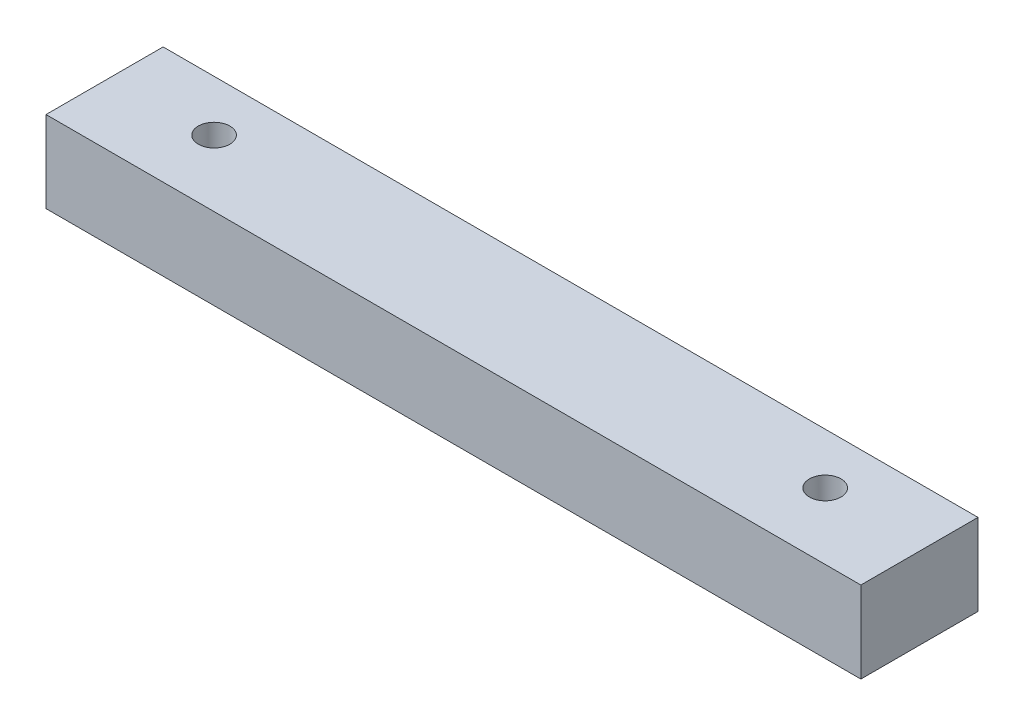
ISO-10303-21;
HEADER;
FILE_DESCRIPTION(('STEP AP214'),'2;1');
FILE_NAME('part.step','',(''),(''),'','','');
FILE_SCHEMA(('AUTOMOTIVE_DESIGN { 1 0 10303 214 1 1 1 1 }'));
ENDSEC;
DATA;
#1=APPLICATION_CONTEXT('core data for automotive mechanical design processes');
#2=APPLICATION_PROTOCOL_DEFINITION('international standard','automotive_design',2000,#1);
#3=PRODUCT_CONTEXT('',#1,'mechanical');
#4=PRODUCT('Part','Part','',(#3));
#5=PRODUCT_RELATED_PRODUCT_CATEGORY('part','',(#4));
#6=PRODUCT_DEFINITION_FORMATION('','',#4);
#7=PRODUCT_DEFINITION_CONTEXT('part definition',#1,'design');
#8=PRODUCT_DEFINITION('design','',#6,#7);
#9=PRODUCT_DEFINITION_SHAPE('','',#8);
#10=(LENGTH_UNIT() NAMED_UNIT(*) SI_UNIT(.MILLI.,.METRE.));
#11=(NAMED_UNIT(*) PLANE_ANGLE_UNIT() SI_UNIT($,.RADIAN.));
#12=(NAMED_UNIT(*) SI_UNIT($,.STERADIAN.) SOLID_ANGLE_UNIT());
#13=UNCERTAINTY_MEASURE_WITH_UNIT(LENGTH_MEASURE(1.E-05),#10,'distance_accuracy_value','');
#14=(GEOMETRIC_REPRESENTATION_CONTEXT(3) GLOBAL_UNCERTAINTY_ASSIGNED_CONTEXT((#13)) GLOBAL_UNIT_ASSIGNED_CONTEXT((#10,
#11,#12)) REPRESENTATION_CONTEXT('',''));
#15=CARTESIAN_POINT('',(0.,0.,0.));
#16=DIRECTION('',(0.,0.,1.));
#17=DIRECTION('',(1.,0.,0.));
#18=AXIS2_PLACEMENT_3D('',#15,#16,#17);
#19=CARTESIAN_POINT('',(0.,0.,11.5));
#20=DIRECTION('',(1.,0.,0.));
#21=DIRECTION('',(0.,0.,-1.));
#22=AXIS2_PLACEMENT_3D('',#19,#20,#21);
#23=PLANE('',#22);
#24=DIRECTION('',(0.,-1.,0.));
#25=VECTOR('',#24,1.);
#26=CARTESIAN_POINT('',(0.,0.,0.));
#27=LINE('',#26,#25);
#28=CARTESIAN_POINT('',(0.,8.,0.));
#29=VERTEX_POINT('',#28);
#30=CARTESIAN_POINT('',(0.,0.,0.));
#31=VERTEX_POINT('',#30);
#32=EDGE_CURVE('E102',#29,#31,#27,.T.);
#33=ORIENTED_EDGE('',*,*,#32,.T.);
#34=DIRECTION('',(0.,0.,-1.));
#35=VECTOR('',#34,1.);
#36=CARTESIAN_POINT('',(0.,0.,11.5));
#37=LINE('',#36,#35);
#38=CARTESIAN_POINT('',(0.,0.,11.5));
#39=VERTEX_POINT('',#38);
#40=EDGE_CURVE('E11',#39,#31,#37,.T.);
#41=ORIENTED_EDGE('',*,*,#40,.F.);
#42=DIRECTION('',(0.,-1.,0.));
#43=VECTOR('',#42,1.);
#44=CARTESIAN_POINT('',(0.,0.,11.5));
#45=LINE('',#44,#43);
#46=CARTESIAN_POINT('',(0.,8.,11.5));
#47=VERTEX_POINT('',#46);
#48=EDGE_CURVE('E90',#47,#39,#45,.T.);
#49=ORIENTED_EDGE('',*,*,#48,.F.);
#50=DIRECTION('',(0.,0.,-1.));
#51=VECTOR('',#50,1.);
#52=CARTESIAN_POINT('',(0.,8.,11.5));
#53=LINE('',#52,#51);
#54=EDGE_CURVE('E98',#47,#29,#53,.T.);
#55=ORIENTED_EDGE('',*,*,#54,.T.);
#56=EDGE_LOOP('',(#33,#41,#49,#55));
#57=FACE_BOUND('',#56,.T.);
#58=ADVANCED_FACE('F39',(#57),#23,.F.);
#59=CARTESIAN_POINT('',(0.,0.,11.5));
#60=DIRECTION('',(0.,1.,0.));
#61=DIRECTION('',(0.,0.,1.));
#62=AXIS2_PLACEMENT_3D('',#59,#60,#61);
#63=PLANE('',#62);
#64=CARTESIAN_POINT('',(9.99999999999999,0.,5.00000000000001));
#65=DIRECTION('',(0.,1.,0.));
#66=DIRECTION('',(0.,0.,1.));
#67=AXIS2_PLACEMENT_3D('',#64,#65,#66);
#68=CIRCLE('',#67,1.55);
#69=CARTESIAN_POINT('',(9.99999999999999,0.,6.55000000000001));
#70=VERTEX_POINT('',#69);
#71=EDGE_CURVE('E105',#70,#70,#68,.F.);
#72=ORIENTED_EDGE('',*,*,#71,.F.);
#73=EDGE_LOOP('',(#72));
#74=FACE_BOUND('',#73,.T.);
#75=CARTESIAN_POINT('',(70.,0.,5.00000000000001));
#76=DIRECTION('',(0.,1.,0.));
#77=DIRECTION('',(0.,0.,1.));
#78=AXIS2_PLACEMENT_3D('',#75,#76,#77);
#79=CIRCLE('',#78,1.55000000000001);
#80=CARTESIAN_POINT('',(70.,0.,6.55000000000002));
#81=VERTEX_POINT('',#80);
#82=EDGE_CURVE('E120',#81,#81,#79,.F.);
#83=ORIENTED_EDGE('',*,*,#82,.F.);
#84=EDGE_LOOP('',(#83));
#85=FACE_BOUND('',#84,.T.);
#86=DIRECTION('',(1.,0.,0.));
#87=VECTOR('',#86,1.);
#88=CARTESIAN_POINT('',(0.,0.,0.));
#89=LINE('',#88,#87);
#90=CARTESIAN_POINT('',(80.,0.,0.));
#91=VERTEX_POINT('',#90);
#92=EDGE_CURVE('E94',#31,#91,#89,.T.);
#93=ORIENTED_EDGE('',*,*,#92,.T.);
#94=DIRECTION('',(0.,0.,-1.));
#95=VECTOR('',#94,1.);
#96=CARTESIAN_POINT('',(80.,0.,11.5));
#97=LINE('',#96,#95);
#98=CARTESIAN_POINT('',(80.,0.,11.5));
#99=VERTEX_POINT('',#98);
#100=EDGE_CURVE('E47',#99,#91,#97,.T.);
#101=ORIENTED_EDGE('',*,*,#100,.F.);
#102=DIRECTION('',(1.,0.,0.));
#103=VECTOR('',#102,1.);
#104=CARTESIAN_POINT('',(0.,0.,11.5));
#105=LINE('',#104,#103);
#106=EDGE_CURVE('E85',#39,#99,#105,.T.);
#107=ORIENTED_EDGE('',*,*,#106,.F.);
#108=ORIENTED_EDGE('',*,*,#40,.T.);
#109=EDGE_LOOP('',(#93,#101,#107,#108));
#110=FACE_BOUND('',#109,.T.);
#111=ADVANCED_FACE('F93',(#74,#85,#110),#63,.F.);
#112=CARTESIAN_POINT('',(80.,0.,11.5));
#113=DIRECTION('',(-1.,0.,0.));
#114=DIRECTION('',(0.,0.,1.));
#115=AXIS2_PLACEMENT_3D('',#112,#113,#114);
#116=PLANE('',#115);
#117=DIRECTION('',(0.,1.,0.));
#118=VECTOR('',#117,1.);
#119=CARTESIAN_POINT('',(80.,0.,0.));
#120=LINE('',#119,#118);
#121=CARTESIAN_POINT('',(80.,8.,0.));
#122=VERTEX_POINT('',#121);
#123=EDGE_CURVE('E72',#91,#122,#120,.T.);
#124=ORIENTED_EDGE('',*,*,#123,.T.);
#125=DIRECTION('',(0.,0.,-1.));
#126=VECTOR('',#125,1.);
#127=CARTESIAN_POINT('',(80.,8.,11.5));
#128=LINE('',#127,#126);
#129=CARTESIAN_POINT('',(80.,8.,11.5));
#130=VERTEX_POINT('',#129);
#131=EDGE_CURVE('E95',#130,#122,#128,.T.);
#132=ORIENTED_EDGE('',*,*,#131,.F.);
#133=DIRECTION('',(0.,1.,0.));
#134=VECTOR('',#133,1.);
#135=CARTESIAN_POINT('',(80.,0.,11.5));
#136=LINE('',#135,#134);
#137=EDGE_CURVE('E88',#99,#130,#136,.T.);
#138=ORIENTED_EDGE('',*,*,#137,.F.);
#139=ORIENTED_EDGE('',*,*,#100,.T.);
#140=EDGE_LOOP('',(#124,#132,#138,#139));
#141=FACE_BOUND('',#140,.T.);
#142=ADVANCED_FACE('F96',(#141),#116,.F.);
#143=CARTESIAN_POINT('',(0.,8.,11.5));
#144=DIRECTION('',(0.,-1.,0.));
#145=DIRECTION('',(0.,0.,-1.));
#146=AXIS2_PLACEMENT_3D('',#143,#144,#145);
#147=PLANE('',#146);
#148=CARTESIAN_POINT('',(9.99999999999999,8.,5.00000000000001));
#149=DIRECTION('',(0.,1.,0.));
#150=DIRECTION('',(0.,0.,1.));
#151=AXIS2_PLACEMENT_3D('',#148,#149,#150);
#152=CIRCLE('',#151,1.55);
#153=CARTESIAN_POINT('',(9.99999999999999,8.,6.55000000000001));
#154=VERTEX_POINT('',#153);
#155=EDGE_CURVE('E119',#154,#154,#152,.T.);
#156=ORIENTED_EDGE('',*,*,#155,.F.);
#157=EDGE_LOOP('',(#156));
#158=FACE_BOUND('',#157,.T.);
#159=CARTESIAN_POINT('',(70.,8.,5.00000000000001));
#160=DIRECTION('',(0.,1.,0.));
#161=DIRECTION('',(0.,0.,-1.));
#162=AXIS2_PLACEMENT_3D('',#159,#160,#161);
#163=CIRCLE('',#162,1.55000000000001);
#164=CARTESIAN_POINT('',(70.,8.,3.45000000000001));
#165=VERTEX_POINT('',#164);
#166=EDGE_CURVE('E116',#165,#165,#163,.T.);
#167=ORIENTED_EDGE('',*,*,#166,.F.);
#168=EDGE_LOOP('',(#167));
#169=FACE_BOUND('',#168,.T.);
#170=DIRECTION('',(-1.,0.,0.));
#171=VECTOR('',#170,1.);
#172=CARTESIAN_POINT('',(0.,8.,0.));
#173=LINE('',#172,#171);
#174=EDGE_CURVE('E78',#122,#29,#173,.T.);
#175=ORIENTED_EDGE('',*,*,#174,.T.);
#176=ORIENTED_EDGE('',*,*,#54,.F.);
#177=DIRECTION('',(-1.,0.,0.));
#178=VECTOR('',#177,1.);
#179=CARTESIAN_POINT('',(0.,8.,11.5));
#180=LINE('',#179,#178);
#181=EDGE_CURVE('E55',#130,#47,#180,.T.);
#182=ORIENTED_EDGE('',*,*,#181,.F.);
#183=ORIENTED_EDGE('',*,*,#131,.T.);
#184=EDGE_LOOP('',(#175,#176,#182,#183));
#185=FACE_BOUND('',#184,.T.);
#186=ADVANCED_FACE('F110',(#158,#169,#185),#147,.F.);
#187=CARTESIAN_POINT('',(0.,0.,11.5));
#188=DIRECTION('',(0.,0.,-1.));
#189=DIRECTION('',(-1.,0.,0.));
#190=AXIS2_PLACEMENT_3D('',#187,#188,#189);
#191=PLANE('',#190);
#192=ORIENTED_EDGE('',*,*,#48,.T.);
#193=ORIENTED_EDGE('',*,*,#106,.T.);
#194=ORIENTED_EDGE('',*,*,#137,.T.);
#195=ORIENTED_EDGE('',*,*,#181,.T.);
#196=EDGE_LOOP('',(#192,#193,#194,#195));
#197=FACE_BOUND('',#196,.T.);
#198=ADVANCED_FACE('F86',(#197),#191,.F.);
#199=CARTESIAN_POINT('',(0.,0.,0.));
#200=DIRECTION('',(0.,0.,-1.));
#201=DIRECTION('',(-1.,0.,0.));
#202=AXIS2_PLACEMENT_3D('',#199,#200,#201);
#203=PLANE('',#202);
#204=ORIENTED_EDGE('',*,*,#32,.F.);
#205=ORIENTED_EDGE('',*,*,#174,.F.);
#206=ORIENTED_EDGE('',*,*,#123,.F.);
#207=ORIENTED_EDGE('',*,*,#92,.F.);
#208=EDGE_LOOP('',(#204,#205,#206,#207));
#209=FACE_BOUND('',#208,.T.);
#210=ADVANCED_FACE('F113',(#209),#203,.T.);
#211=CARTESIAN_POINT('',(70.,-0.000999999999999265,5.00000000000001));
#212=DIRECTION('',(0.,1.,0.));
#213=DIRECTION('',(0.,0.,1.));
#214=AXIS2_PLACEMENT_3D('',#211,#212,#213);
#215=CYLINDRICAL_SURFACE('',#214,1.55000000000001);
#216=ORIENTED_EDGE('',*,*,#166,.T.);
#217=EDGE_LOOP('',(#216));
#218=FACE_BOUND('',#217,.T.);
#219=ORIENTED_EDGE('',*,*,#82,.T.);
#220=EDGE_LOOP('',(#219));
#221=FACE_BOUND('',#220,.T.);
#222=ADVANCED_FACE('F136',(#218,#221),#215,.F.);
#223=CARTESIAN_POINT('',(9.99999999999999,-0.000999999999999265,5.00000000000001));
#224=DIRECTION('',(0.,1.,0.));
#225=DIRECTION('',(0.,0.,1.));
#226=AXIS2_PLACEMENT_3D('',#223,#224,#225);
#227=CYLINDRICAL_SURFACE('',#226,1.55);
#228=ORIENTED_EDGE('',*,*,#155,.T.);
#229=EDGE_LOOP('',(#228));
#230=FACE_BOUND('',#229,.T.);
#231=ORIENTED_EDGE('',*,*,#71,.T.);
#232=EDGE_LOOP('',(#231));
#233=FACE_BOUND('',#232,.T.);
#234=ADVANCED_FACE('F128',(#230,#233),#227,.F.);
#235=CLOSED_SHELL('',(#58,#111,#142,#186,#198,#210,#222,#234));
#236=MANIFOLD_SOLID_BREP('B2',#235);
#237=ADVANCED_BREP_SHAPE_REPRESENTATION('',(#18,#236),#14);
#238=SHAPE_DEFINITION_REPRESENTATION(#9,#237);
ENDSEC;
END-ISO-10303-21;
